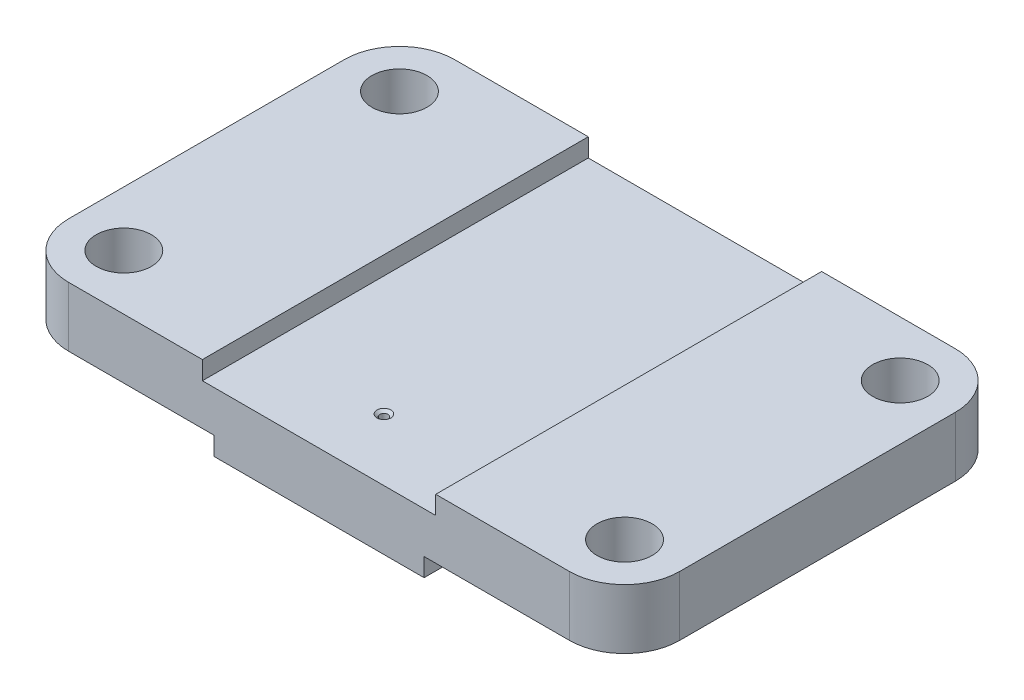
ISO-10303-21;
HEADER;
FILE_DESCRIPTION(('STEP AP214'),'2;1');
FILE_NAME('part.step','',(''),(''),'','','');
FILE_SCHEMA(('AUTOMOTIVE_DESIGN { 1 0 10303 214 1 1 1 1 }'));
ENDSEC;
DATA;
#1=APPLICATION_CONTEXT('core data for automotive mechanical design processes');
#2=APPLICATION_PROTOCOL_DEFINITION('international standard','automotive_design',2000,#1);
#3=PRODUCT_CONTEXT('',#1,'mechanical');
#4=PRODUCT('Part','Part','',(#3));
#5=PRODUCT_RELATED_PRODUCT_CATEGORY('part','',(#4));
#6=PRODUCT_DEFINITION_FORMATION('','',#4);
#7=PRODUCT_DEFINITION_CONTEXT('part definition',#1,'design');
#8=PRODUCT_DEFINITION('design','',#6,#7);
#9=PRODUCT_DEFINITION_SHAPE('','',#8);
#10=(LENGTH_UNIT() NAMED_UNIT(*) SI_UNIT(.MILLI.,.METRE.));
#11=(NAMED_UNIT(*) PLANE_ANGLE_UNIT() SI_UNIT($,.RADIAN.));
#12=(NAMED_UNIT(*) SI_UNIT($,.STERADIAN.) SOLID_ANGLE_UNIT());
#13=UNCERTAINTY_MEASURE_WITH_UNIT(LENGTH_MEASURE(1.E-05),#10,'distance_accuracy_value','');
#14=(GEOMETRIC_REPRESENTATION_CONTEXT(3) GLOBAL_UNCERTAINTY_ASSIGNED_CONTEXT((#13)) GLOBAL_UNIT_ASSIGNED_CONTEXT((#10,
#11,#12)) REPRESENTATION_CONTEXT('',''));
#15=CARTESIAN_POINT('',(0.,0.,0.));
#16=DIRECTION('',(0.,0.,1.));
#17=DIRECTION('',(1.,0.,0.));
#18=AXIS2_PLACEMENT_3D('',#15,#16,#17);
#19=CARTESIAN_POINT('',(66.5,-13.,42.));
#20=DIRECTION('',(0.,1.,0.));
#21=DIRECTION('',(0.,0.,1.));
#22=AXIS2_PLACEMENT_3D('',#19,#20,#21);
#23=PLANE('',#22);
#24=CARTESIAN_POINT('',(54.5,-13.,30.0000000000012));
#25=DIRECTION('',(0.,1.,0.));
#26=DIRECTION('',(0.,0.,1.));
#27=AXIS2_PLACEMENT_3D('',#24,#25,#26);
#28=CIRCLE('',#27,5.99999999999999);
#29=CARTESIAN_POINT('',(54.5,-13.,36.0000000000012));
#30=VERTEX_POINT('',#29);
#31=EDGE_CURVE('E349',#30,#30,#28,.T.);
#32=ORIENTED_EDGE('',*,*,#31,.T.);
#33=EDGE_LOOP('',(#32));
#34=FACE_BOUND('',#33,.T.);
#35=CARTESIAN_POINT('',(54.5,-13.,-29.9999999999988));
#36=DIRECTION('',(0.,1.,0.));
#37=DIRECTION('',(0.,0.,1.));
#38=AXIS2_PLACEMENT_3D('',#35,#36,#37);
#39=CIRCLE('',#38,5.99999999999999);
#40=CARTESIAN_POINT('',(54.5,-13.,-23.9999999999988));
#41=VERTEX_POINT('',#40);
#42=EDGE_CURVE('E342',#41,#41,#39,.T.);
#43=ORIENTED_EDGE('',*,*,#42,.T.);
#44=EDGE_LOOP('',(#43));
#45=FACE_BOUND('',#44,.T.);
#46=DIRECTION('',(0.,0.,1.));
#47=VECTOR('',#46,1.);
#48=CARTESIAN_POINT('',(66.5,-13.,-42.));
#49=LINE('',#48,#47);
#50=CARTESIAN_POINT('',(66.5,-13.,-30.));
#51=VERTEX_POINT('',#50);
#52=CARTESIAN_POINT('',(66.5,-13.,30.));
#53=VERTEX_POINT('',#52);
#54=EDGE_CURVE('E220',#51,#53,#49,.T.);
#55=ORIENTED_EDGE('',*,*,#54,.T.);
#56=CARTESIAN_POINT('',(54.5,-13.,30.));
#57=DIRECTION('',(0.,1.,0.));
#58=DIRECTION('',(0.,0.,1.));
#59=AXIS2_PLACEMENT_3D('',#56,#57,#58);
#60=CIRCLE('',#59,12.);
#61=CARTESIAN_POINT('',(54.5,-13.,42.));
#62=VERTEX_POINT('',#61);
#63=EDGE_CURVE('E303',#53,#62,#60,.F.);
#64=ORIENTED_EDGE('',*,*,#63,.T.);
#65=DIRECTION('',(1.,0.,0.));
#66=VECTOR('',#65,1.);
#67=CARTESIAN_POINT('',(-66.5,-13.,42.));
#68=LINE('',#67,#66);
#69=CARTESIAN_POINT('',(22.86,-13.,42.));
#70=VERTEX_POINT('',#69);
#71=EDGE_CURVE('E182',#70,#62,#68,.T.);
#72=ORIENTED_EDGE('',*,*,#71,.F.);
#73=DIRECTION('',(0.,0.,1.));
#74=VECTOR('',#73,1.);
#75=CARTESIAN_POINT('',(22.86,-13.,-42.));
#76=LINE('',#75,#74);
#77=CARTESIAN_POINT('',(22.86,-13.,-42.));
#78=VERTEX_POINT('',#77);
#79=EDGE_CURVE('E173',#78,#70,#76,.T.);
#80=ORIENTED_EDGE('',*,*,#79,.F.);
#81=DIRECTION('',(-1.,0.,0.));
#82=VECTOR('',#81,1.);
#83=CARTESIAN_POINT('',(66.5,-13.,-42.));
#84=LINE('',#83,#82);
#85=CARTESIAN_POINT('',(54.5,-13.,-42.));
#86=VERTEX_POINT('',#85);
#87=EDGE_CURVE('E154',#86,#78,#84,.T.);
#88=ORIENTED_EDGE('',*,*,#87,.F.);
#89=CARTESIAN_POINT('',(54.5,-13.,-30.));
#90=DIRECTION('',(0.,1.,0.));
#91=DIRECTION('',(0.,0.,1.));
#92=AXIS2_PLACEMENT_3D('',#89,#90,#91);
#93=CIRCLE('',#92,12.);
#94=EDGE_CURVE('E250',#86,#51,#93,.F.);
#95=ORIENTED_EDGE('',*,*,#94,.T.);
#96=EDGE_LOOP('',(#55,#64,#72,#80,#88,#95));
#97=FACE_BOUND('',#96,.T.);
#98=ADVANCED_FACE('F41',(#34,#45,#97),#23,.F.);
#99=CARTESIAN_POINT('',(66.5,0.,42.));
#100=DIRECTION('',(0.,1.,0.));
#101=DIRECTION('',(0.,0.,1.));
#102=AXIS2_PLACEMENT_3D('',#99,#100,#101);
#103=PLANE('',#102);
#104=CARTESIAN_POINT('',(-54.5,0.,-29.9999999999988));
#105=DIRECTION('',(0.,1.,0.));
#106=DIRECTION('',(0.,0.,1.));
#107=AXIS2_PLACEMENT_3D('',#104,#105,#106);
#108=CIRCLE('',#107,5.99999999999999);
#109=CARTESIAN_POINT('',(-54.5,0.,-23.9999999999988));
#110=VERTEX_POINT('',#109);
#111=EDGE_CURVE('E401',#110,#110,#108,.T.);
#112=ORIENTED_EDGE('',*,*,#111,.F.);
#113=EDGE_LOOP('',(#112));
#114=FACE_BOUND('',#113,.T.);
#115=CARTESIAN_POINT('',(-54.5,0.,30.0000000000012));
#116=DIRECTION('',(0.,1.,0.));
#117=DIRECTION('',(0.,0.,1.));
#118=AXIS2_PLACEMENT_3D('',#115,#116,#117);
#119=CIRCLE('',#118,6.);
#120=CARTESIAN_POINT('',(-54.5,0.,36.0000000000012));
#121=VERTEX_POINT('',#120);
#122=EDGE_CURVE('E393',#121,#121,#119,.T.);
#123=ORIENTED_EDGE('',*,*,#122,.F.);
#124=EDGE_LOOP('',(#123));
#125=FACE_BOUND('',#124,.T.);
#126=DIRECTION('',(-1.,0.,0.));
#127=VECTOR('',#126,1.);
#128=CARTESIAN_POINT('',(66.5,0.,-42.));
#129=LINE('',#128,#127);
#130=CARTESIAN_POINT('',(-25.4,0.,-42.));
#131=VERTEX_POINT('',#130);
#132=CARTESIAN_POINT('',(-54.5,0.,-42.));
#133=VERTEX_POINT('',#132);
#134=EDGE_CURVE('E318',#131,#133,#129,.T.);
#135=ORIENTED_EDGE('',*,*,#134,.T.);
#136=CARTESIAN_POINT('',(-54.5,0.,-30.));
#137=DIRECTION('',(0.,1.,0.));
#138=DIRECTION('',(0.,0.,1.));
#139=AXIS2_PLACEMENT_3D('',#136,#137,#138);
#140=CIRCLE('',#139,12.);
#141=CARTESIAN_POINT('',(-66.5,0.,-30.));
#142=VERTEX_POINT('',#141);
#143=EDGE_CURVE('E296',#133,#142,#140,.T.);
#144=ORIENTED_EDGE('',*,*,#143,.T.);
#145=DIRECTION('',(0.,0.,-1.));
#146=VECTOR('',#145,1.);
#147=CARTESIAN_POINT('',(-66.5,0.,42.));
#148=LINE('',#147,#146);
#149=CARTESIAN_POINT('',(-66.5,0.,30.));
#150=VERTEX_POINT('',#149);
#151=EDGE_CURVE('E321',#150,#142,#148,.T.);
#152=ORIENTED_EDGE('',*,*,#151,.F.);
#153=CARTESIAN_POINT('',(-54.5,0.,30.));
#154=DIRECTION('',(0.,1.,0.));
#155=DIRECTION('',(0.,0.,1.));
#156=AXIS2_PLACEMENT_3D('',#153,#154,#155);
#157=CIRCLE('',#156,12.);
#158=CARTESIAN_POINT('',(-54.5,0.,42.));
#159=VERTEX_POINT('',#158);
#160=EDGE_CURVE('E298',#150,#159,#157,.T.);
#161=ORIENTED_EDGE('',*,*,#160,.T.);
#162=DIRECTION('',(1.,0.,0.));
#163=VECTOR('',#162,1.);
#164=CARTESIAN_POINT('',(-66.5,0.,42.));
#165=LINE('',#164,#163);
#166=CARTESIAN_POINT('',(-25.4,0.,42.));
#167=VERTEX_POINT('',#166);
#168=EDGE_CURVE('E333',#159,#167,#165,.T.);
#169=ORIENTED_EDGE('',*,*,#168,.T.);
#170=DIRECTION('',(0.,0.,-1.));
#171=VECTOR('',#170,1.);
#172=CARTESIAN_POINT('',(-25.4,0.,42.));
#173=LINE('',#172,#171);
#174=EDGE_CURVE('E206',#167,#131,#173,.T.);
#175=ORIENTED_EDGE('',*,*,#174,.T.);
#176=EDGE_LOOP('',(#135,#144,#152,#161,#169,#175));
#177=FACE_BOUND('',#176,.T.);
#178=ADVANCED_FACE('F358',(#114,#125,#177),#103,.T.);
#179=CARTESIAN_POINT('',(66.5,-13.,-42.));
#180=DIRECTION('',(-1.,0.,0.));
#181=DIRECTION('',(0.,0.,1.));
#182=AXIS2_PLACEMENT_3D('',#179,#180,#181);
#183=PLANE('',#182);
#184=DIRECTION('',(0.,0.,1.));
#185=VECTOR('',#184,1.);
#186=CARTESIAN_POINT('',(66.5,0.,-42.));
#187=LINE('',#186,#185);
#188=CARTESIAN_POINT('',(66.5,0.,-30.));
#189=VERTEX_POINT('',#188);
#190=CARTESIAN_POINT('',(66.5,0.,30.));
#191=VERTEX_POINT('',#190);
#192=EDGE_CURVE('E219',#189,#191,#187,.T.);
#193=ORIENTED_EDGE('',*,*,#192,.T.);
#194=DIRECTION('',(0.,1.,0.));
#195=VECTOR('',#194,1.);
#196=CARTESIAN_POINT('',(66.5,-13.,30.));
#197=LINE('',#196,#195);
#198=EDGE_CURVE('E249',#191,#53,#197,.F.);
#199=ORIENTED_EDGE('',*,*,#198,.T.);
#200=ORIENTED_EDGE('',*,*,#54,.F.);
#201=DIRECTION('',(0.,1.,0.));
#202=VECTOR('',#201,1.);
#203=CARTESIAN_POINT('',(66.5,0.,-30.));
#204=LINE('',#203,#202);
#205=EDGE_CURVE('E246',#51,#189,#204,.T.);
#206=ORIENTED_EDGE('',*,*,#205,.T.);
#207=EDGE_LOOP('',(#193,#199,#200,#206));
#208=FACE_BOUND('',#207,.T.);
#209=ADVANCED_FACE('F310',(#208),#183,.F.);
#210=CARTESIAN_POINT('',(-66.5,-13.,42.));
#211=DIRECTION('',(0.,0.,1.));
#212=DIRECTION('',(1.,0.,0.));
#213=AXIS2_PLACEMENT_3D('',#210,#211,#212);
#214=PLANE('',#213);
#215=ORIENTED_EDGE('',*,*,#71,.T.);
#216=DIRECTION('',(0.,1.,0.));
#217=VECTOR('',#216,1.);
#218=CARTESIAN_POINT('',(54.5,0.,42.));
#219=LINE('',#218,#217);
#220=CARTESIAN_POINT('',(54.5,0.,42.));
#221=VERTEX_POINT('',#220);
#222=EDGE_CURVE('E239',#62,#221,#219,.T.);
#223=ORIENTED_EDGE('',*,*,#222,.T.);
#224=CARTESIAN_POINT('',(25.4,0.,42.));
#225=VERTEX_POINT('',#224);
#226=EDGE_CURVE('E336',#225,#221,#165,.T.);
#227=ORIENTED_EDGE('',*,*,#226,.F.);
#228=DIRECTION('',(0.,-1.,0.));
#229=VECTOR('',#228,1.);
#230=CARTESIAN_POINT('',(25.4,0.,42.));
#231=LINE('',#230,#229);
#232=CARTESIAN_POINT('',(25.4,-4.00000000000001,42.));
#233=VERTEX_POINT('',#232);
#234=EDGE_CURVE('E186',#225,#233,#231,.T.);
#235=ORIENTED_EDGE('',*,*,#234,.T.);
#236=DIRECTION('',(-1.,0.,0.));
#237=VECTOR('',#236,1.);
#238=CARTESIAN_POINT('',(-25.4,-4.,42.));
#239=LINE('',#238,#237);
#240=CARTESIAN_POINT('',(-25.4,-4.,42.));
#241=VERTEX_POINT('',#240);
#242=EDGE_CURVE('E201',#233,#241,#239,.T.);
#243=ORIENTED_EDGE('',*,*,#242,.T.);
#244=DIRECTION('',(0.,1.,0.));
#245=VECTOR('',#244,1.);
#246=CARTESIAN_POINT('',(-25.4,0.,42.));
#247=LINE('',#246,#245);
#248=EDGE_CURVE('E204',#241,#167,#247,.T.);
#249=ORIENTED_EDGE('',*,*,#248,.T.);
#250=ORIENTED_EDGE('',*,*,#168,.F.);
#251=DIRECTION('',(0.,1.,0.));
#252=VECTOR('',#251,1.);
#253=CARTESIAN_POINT('',(-54.5,-13.,42.));
#254=LINE('',#253,#252);
#255=CARTESIAN_POINT('',(-54.5,-13.,42.));
#256=VERTEX_POINT('',#255);
#257=EDGE_CURVE('E237',#159,#256,#254,.F.);
#258=ORIENTED_EDGE('',*,*,#257,.T.);
#259=CARTESIAN_POINT('',(-22.86,-13.,42.));
#260=VERTEX_POINT('',#259);
#261=EDGE_CURVE('E232',#256,#260,#68,.T.);
#262=ORIENTED_EDGE('',*,*,#261,.T.);
#263=DIRECTION('',(0.,-1.,0.));
#264=VECTOR('',#263,1.);
#265=CARTESIAN_POINT('',(-22.86,-13.,42.));
#266=LINE('',#265,#264);
#267=CARTESIAN_POINT('',(-22.86,-17.,42.));
#268=VERTEX_POINT('',#267);
#269=EDGE_CURVE('E178',#260,#268,#266,.T.);
#270=ORIENTED_EDGE('',*,*,#269,.T.);
#271=DIRECTION('',(1.,0.,0.));
#272=VECTOR('',#271,1.);
#273=CARTESIAN_POINT('',(-22.86,-17.,42.));
#274=LINE('',#273,#272);
#275=CARTESIAN_POINT('',(22.86,-17.,42.));
#276=VERTEX_POINT('',#275);
#277=EDGE_CURVE('E261',#268,#276,#274,.T.);
#278=ORIENTED_EDGE('',*,*,#277,.T.);
#279=DIRECTION('',(0.,-1.,0.));
#280=VECTOR('',#279,1.);
#281=CARTESIAN_POINT('',(22.86,-13.,42.));
#282=LINE('',#281,#280);
#283=EDGE_CURVE('E194',#70,#276,#282,.T.);
#284=ORIENTED_EDGE('',*,*,#283,.F.);
#285=EDGE_LOOP('',(#215,#223,#227,#235,#243,#249,#250,#258,#262,#270,#278,#284));
#286=FACE_BOUND('',#285,.T.);
#287=ADVANCED_FACE('F283',(#286),#214,.T.);
#288=CARTESIAN_POINT('',(-66.5,-13.,42.));
#289=DIRECTION('',(1.,0.,0.));
#290=DIRECTION('',(0.,0.,-1.));
#291=AXIS2_PLACEMENT_3D('',#288,#289,#290);
#292=PLANE('',#291);
#293=ORIENTED_EDGE('',*,*,#151,.T.);
#294=DIRECTION('',(0.,1.,0.));
#295=VECTOR('',#294,1.);
#296=CARTESIAN_POINT('',(-66.5,-13.,-30.));
#297=LINE('',#296,#295);
#298=CARTESIAN_POINT('',(-66.5,-13.,-30.));
#299=VERTEX_POINT('',#298);
#300=EDGE_CURVE('E57',#142,#299,#297,.F.);
#301=ORIENTED_EDGE('',*,*,#300,.T.);
#302=DIRECTION('',(0.,0.,-1.));
#303=VECTOR('',#302,1.);
#304=CARTESIAN_POINT('',(-66.5,-13.,42.));
#305=LINE('',#304,#303);
#306=CARTESIAN_POINT('',(-66.5,-13.,30.));
#307=VERTEX_POINT('',#306);
#308=EDGE_CURVE('E225',#307,#299,#305,.T.);
#309=ORIENTED_EDGE('',*,*,#308,.F.);
#310=DIRECTION('',(0.,1.,0.));
#311=VECTOR('',#310,1.);
#312=CARTESIAN_POINT('',(-66.5,0.,30.));
#313=LINE('',#312,#311);
#314=EDGE_CURVE('E291',#307,#150,#313,.T.);
#315=ORIENTED_EDGE('',*,*,#314,.T.);
#316=EDGE_LOOP('',(#293,#301,#309,#315));
#317=FACE_BOUND('',#316,.T.);
#318=ADVANCED_FACE('F360',(#317),#292,.F.);
#319=CARTESIAN_POINT('',(66.5,-13.,-42.));
#320=DIRECTION('',(0.,0.,-1.));
#321=DIRECTION('',(-1.,0.,0.));
#322=AXIS2_PLACEMENT_3D('',#319,#320,#321);
#323=PLANE('',#322);
#324=CARTESIAN_POINT('',(54.5,0.,-42.));
#325=VERTEX_POINT('',#324);
#326=CARTESIAN_POINT('',(25.4,0.,-42.));
#327=VERTEX_POINT('',#326);
#328=EDGE_CURVE('E222',#325,#327,#129,.T.);
#329=ORIENTED_EDGE('',*,*,#328,.F.);
#330=DIRECTION('',(0.,1.,0.));
#331=VECTOR('',#330,1.);
#332=CARTESIAN_POINT('',(54.5,-13.,-42.));
#333=LINE('',#332,#331);
#334=EDGE_CURVE('E162',#325,#86,#333,.F.);
#335=ORIENTED_EDGE('',*,*,#334,.T.);
#336=ORIENTED_EDGE('',*,*,#87,.T.);
#337=DIRECTION('',(0.,-1.,0.));
#338=VECTOR('',#337,1.);
#339=CARTESIAN_POINT('',(22.86,-13.,-42.));
#340=LINE('',#339,#338);
#341=CARTESIAN_POINT('',(22.86,-17.,-42.));
#342=VERTEX_POINT('',#341);
#343=EDGE_CURVE('E159',#78,#342,#340,.T.);
#344=ORIENTED_EDGE('',*,*,#343,.T.);
#345=DIRECTION('',(1.,0.,0.));
#346=VECTOR('',#345,1.);
#347=CARTESIAN_POINT('',(-22.86,-17.,-42.));
#348=LINE('',#347,#346);
#349=CARTESIAN_POINT('',(-22.86,-17.,-42.));
#350=VERTEX_POINT('',#349);
#351=EDGE_CURVE('E177',#350,#342,#348,.T.);
#352=ORIENTED_EDGE('',*,*,#351,.F.);
#353=DIRECTION('',(0.,-1.,0.));
#354=VECTOR('',#353,1.);
#355=CARTESIAN_POINT('',(-22.86,-13.,-42.));
#356=LINE('',#355,#354);
#357=CARTESIAN_POINT('',(-22.86,-13.,-42.));
#358=VERTEX_POINT('',#357);
#359=EDGE_CURVE('E268',#358,#350,#356,.T.);
#360=ORIENTED_EDGE('',*,*,#359,.F.);
#361=CARTESIAN_POINT('',(-54.5,-13.,-42.));
#362=VERTEX_POINT('',#361);
#363=EDGE_CURVE('E167',#358,#362,#84,.T.);
#364=ORIENTED_EDGE('',*,*,#363,.T.);
#365=DIRECTION('',(0.,1.,0.));
#366=VECTOR('',#365,1.);
#367=CARTESIAN_POINT('',(-54.5,0.,-42.));
#368=LINE('',#367,#366);
#369=EDGE_CURVE('E301',#362,#133,#368,.T.);
#370=ORIENTED_EDGE('',*,*,#369,.T.);
#371=ORIENTED_EDGE('',*,*,#134,.F.);
#372=DIRECTION('',(0.,1.,0.));
#373=VECTOR('',#372,1.);
#374=CARTESIAN_POINT('',(-25.4,-13.0000000000001,-42.));
#375=LINE('',#374,#373);
#376=CARTESIAN_POINT('',(-25.4,-4.,-42.));
#377=VERTEX_POINT('',#376);
#378=EDGE_CURVE('E216',#377,#131,#375,.T.);
#379=ORIENTED_EDGE('',*,*,#378,.F.);
#380=DIRECTION('',(-1.,0.,0.));
#381=VECTOR('',#380,1.);
#382=CARTESIAN_POINT('',(66.5,-4.00000000000001,-42.));
#383=LINE('',#382,#381);
#384=CARTESIAN_POINT('',(25.4,-4.00000000000001,-42.));
#385=VERTEX_POINT('',#384);
#386=EDGE_CURVE('E166',#385,#377,#383,.T.);
#387=ORIENTED_EDGE('',*,*,#386,.F.);
#388=DIRECTION('',(0.,-1.,0.));
#389=VECTOR('',#388,1.);
#390=CARTESIAN_POINT('',(25.4,-13.,-42.));
#391=LINE('',#390,#389);
#392=EDGE_CURVE('E213',#327,#385,#391,.T.);
#393=ORIENTED_EDGE('',*,*,#392,.F.);
#394=EDGE_LOOP('',(#329,#335,#336,#344,#352,#360,#364,#370,#371,#379,#387,#393));
#395=FACE_BOUND('',#394,.T.);
#396=ADVANCED_FACE('F157',(#395),#323,.T.);
#397=CARTESIAN_POINT('',(-54.5,-13.,-29.9999999999988));
#398=DIRECTION('',(0.,1.,0.));
#399=DIRECTION('',(0.,0.,1.));
#400=AXIS2_PLACEMENT_3D('',#397,#398,#399);
#401=CIRCLE('',#400,5.99999999999999);
#402=CARTESIAN_POINT('',(-54.5,-13.,-23.9999999999988));
#403=VERTEX_POINT('',#402);
#404=EDGE_CURVE('E235',#403,#403,#401,.T.);
#405=ORIENTED_EDGE('',*,*,#404,.T.);
#406=EDGE_LOOP('',(#405));
#407=FACE_BOUND('',#406,.T.);
#408=CARTESIAN_POINT('',(-54.5,-13.,30.0000000000012));
#409=DIRECTION('',(0.,1.,0.));
#410=DIRECTION('',(0.,0.,1.));
#411=AXIS2_PLACEMENT_3D('',#408,#409,#410);
#412=CIRCLE('',#411,6.);
#413=CARTESIAN_POINT('',(-54.5,-13.,36.0000000000012));
#414=VERTEX_POINT('',#413);
#415=EDGE_CURVE('E390',#414,#414,#412,.T.);
#416=ORIENTED_EDGE('',*,*,#415,.T.);
#417=EDGE_LOOP('',(#416));
#418=FACE_BOUND('',#417,.T.);
#419=ORIENTED_EDGE('',*,*,#308,.T.);
#420=CARTESIAN_POINT('',(-54.5,-13.,-30.));
#421=DIRECTION('',(0.,1.,0.));
#422=DIRECTION('',(0.,0.,1.));
#423=AXIS2_PLACEMENT_3D('',#420,#421,#422);
#424=CIRCLE('',#423,12.);
#425=EDGE_CURVE('E11',#299,#362,#424,.F.);
#426=ORIENTED_EDGE('',*,*,#425,.T.);
#427=ORIENTED_EDGE('',*,*,#363,.F.);
#428=DIRECTION('',(0.,0.,1.));
#429=VECTOR('',#428,1.);
#430=CARTESIAN_POINT('',(-22.86,-13.,-42.));
#431=LINE('',#430,#429);
#432=EDGE_CURVE('E264',#358,#260,#431,.T.);
#433=ORIENTED_EDGE('',*,*,#432,.T.);
#434=ORIENTED_EDGE('',*,*,#261,.F.);
#435=CARTESIAN_POINT('',(-54.5,-13.,30.));
#436=DIRECTION('',(0.,1.,0.));
#437=DIRECTION('',(0.,0.,1.));
#438=AXIS2_PLACEMENT_3D('',#435,#436,#437);
#439=CIRCLE('',#438,12.);
#440=EDGE_CURVE('E50',#256,#307,#439,.F.);
#441=ORIENTED_EDGE('',*,*,#440,.T.);
#442=EDGE_LOOP('',(#419,#426,#427,#433,#434,#441));
#443=FACE_BOUND('',#442,.T.);
#444=ADVANCED_FACE('F286',(#407,#418,#443),#23,.F.);
#445=CARTESIAN_POINT('',(54.5,0.,30.0000000000012));
#446=DIRECTION('',(0.,1.,0.));
#447=DIRECTION('',(0.,0.,1.));
#448=AXIS2_PLACEMENT_3D('',#445,#446,#447);
#449=CIRCLE('',#448,5.99999999999999);
#450=CARTESIAN_POINT('',(54.5,0.,36.0000000000012));
#451=VERTEX_POINT('',#450);
#452=EDGE_CURVE('E392',#451,#451,#449,.T.);
#453=ORIENTED_EDGE('',*,*,#452,.F.);
#454=EDGE_LOOP('',(#453));
#455=FACE_BOUND('',#454,.T.);
#456=CARTESIAN_POINT('',(54.5,0.,-29.9999999999988));
#457=DIRECTION('',(0.,1.,0.));
#458=DIRECTION('',(0.,0.,1.));
#459=AXIS2_PLACEMENT_3D('',#456,#457,#458);
#460=CIRCLE('',#459,5.99999999999999);
#461=CARTESIAN_POINT('',(54.5,0.,-23.9999999999988));
#462=VERTEX_POINT('',#461);
#463=EDGE_CURVE('E344',#462,#462,#460,.T.);
#464=ORIENTED_EDGE('',*,*,#463,.F.);
#465=EDGE_LOOP('',(#464));
#466=FACE_BOUND('',#465,.T.);
#467=ORIENTED_EDGE('',*,*,#226,.T.);
#468=CARTESIAN_POINT('',(54.5,0.,30.));
#469=DIRECTION('',(0.,1.,0.));
#470=DIRECTION('',(0.,0.,1.));
#471=AXIS2_PLACEMENT_3D('',#468,#469,#470);
#472=CIRCLE('',#471,12.);
#473=EDGE_CURVE('E244',#221,#191,#472,.T.);
#474=ORIENTED_EDGE('',*,*,#473,.T.);
#475=ORIENTED_EDGE('',*,*,#192,.F.);
#476=CARTESIAN_POINT('',(54.5,0.,-30.));
#477=DIRECTION('',(0.,1.,0.));
#478=DIRECTION('',(0.,0.,1.));
#479=AXIS2_PLACEMENT_3D('',#476,#477,#478);
#480=CIRCLE('',#479,12.);
#481=EDGE_CURVE('E242',#189,#325,#480,.T.);
#482=ORIENTED_EDGE('',*,*,#481,.T.);
#483=ORIENTED_EDGE('',*,*,#328,.T.);
#484=DIRECTION('',(0.,0.,-1.));
#485=VECTOR('',#484,1.);
#486=CARTESIAN_POINT('',(25.4,0.,42.));
#487=LINE('',#486,#485);
#488=EDGE_CURVE('E183',#225,#327,#487,.T.);
#489=ORIENTED_EDGE('',*,*,#488,.F.);
#490=EDGE_LOOP('',(#467,#474,#475,#482,#483,#489));
#491=FACE_BOUND('',#490,.T.);
#492=ADVANCED_FACE('F316',(#455,#466,#491),#103,.T.);
#493=CARTESIAN_POINT('',(-25.4,0.,42.));
#494=DIRECTION('',(-1.,0.,0.));
#495=DIRECTION('',(0.,-1.,0.));
#496=AXIS2_PLACEMENT_3D('',#493,#494,#495);
#497=PLANE('',#496);
#498=DIRECTION('',(0.,0.,-1.));
#499=VECTOR('',#498,1.);
#500=CARTESIAN_POINT('',(-25.4,-4.,42.));
#501=LINE('',#500,#499);
#502=EDGE_CURVE('E203',#241,#377,#501,.T.);
#503=ORIENTED_EDGE('',*,*,#502,.T.);
#504=ORIENTED_EDGE('',*,*,#378,.T.);
#505=ORIENTED_EDGE('',*,*,#174,.F.);
#506=ORIENTED_EDGE('',*,*,#248,.F.);
#507=EDGE_LOOP('',(#503,#504,#505,#506));
#508=FACE_BOUND('',#507,.T.);
#509=ADVANCED_FACE('F331',(#508),#497,.F.);
#510=CARTESIAN_POINT('',(-25.4,-4.,42.));
#511=DIRECTION('',(0.,-1.,0.));
#512=DIRECTION('',(1.,0.,0.));
#513=AXIS2_PLACEMENT_3D('',#510,#511,#512);
#514=PLANE('',#513);
#515=CARTESIAN_POINT('',(0.622969363223918,-4.,28.5000321046915));
#516=DIRECTION('',(0.,1.,0.));
#517=DIRECTION('',(0.,0.,1.));
#518=AXIS2_PLACEMENT_3D('',#515,#516,#517);
#519=CIRCLE('',#518,1.5113);
#520=CARTESIAN_POINT('',(0.622969363223918,-4.,30.0113321046915));
#521=VERTEX_POINT('',#520);
#522=EDGE_CURVE('E588',#521,#521,#519,.T.);
#523=ORIENTED_EDGE('',*,*,#522,.F.);
#524=EDGE_LOOP('',(#523));
#525=FACE_BOUND('',#524,.T.);
#526=DIRECTION('',(0.,0.,-1.));
#527=VECTOR('',#526,1.);
#528=CARTESIAN_POINT('',(25.4,-4.00000000000001,42.));
#529=LINE('',#528,#527);
#530=EDGE_CURVE('E200',#233,#385,#529,.T.);
#531=ORIENTED_EDGE('',*,*,#530,.T.);
#532=ORIENTED_EDGE('',*,*,#386,.T.);
#533=ORIENTED_EDGE('',*,*,#502,.F.);
#534=ORIENTED_EDGE('',*,*,#242,.F.);
#535=EDGE_LOOP('',(#531,#532,#533,#534));
#536=FACE_BOUND('',#535,.T.);
#537=ADVANCED_FACE('F326',(#525,#536),#514,.F.);
#538=CARTESIAN_POINT('',(25.4,0.,42.));
#539=DIRECTION('',(1.,0.,0.));
#540=DIRECTION('',(0.,1.,0.));
#541=AXIS2_PLACEMENT_3D('',#538,#539,#540);
#542=PLANE('',#541);
#543=ORIENTED_EDGE('',*,*,#488,.T.);
#544=ORIENTED_EDGE('',*,*,#392,.T.);
#545=ORIENTED_EDGE('',*,*,#530,.F.);
#546=ORIENTED_EDGE('',*,*,#234,.F.);
#547=EDGE_LOOP('',(#543,#544,#545,#546));
#548=FACE_BOUND('',#547,.T.);
#549=ADVANCED_FACE('F338',(#548),#542,.F.);
#550=CARTESIAN_POINT('',(22.86,-13.,-42.));
#551=DIRECTION('',(-1.,0.,0.));
#552=DIRECTION('',(0.,0.,1.));
#553=AXIS2_PLACEMENT_3D('',#550,#551,#552);
#554=PLANE('',#553);
#555=ORIENTED_EDGE('',*,*,#283,.T.);
#556=DIRECTION('',(0.,0.,1.));
#557=VECTOR('',#556,1.);
#558=CARTESIAN_POINT('',(22.86,-17.,-42.));
#559=LINE('',#558,#557);
#560=EDGE_CURVE('E175',#342,#276,#559,.T.);
#561=ORIENTED_EDGE('',*,*,#560,.F.);
#562=ORIENTED_EDGE('',*,*,#343,.F.);
#563=ORIENTED_EDGE('',*,*,#79,.T.);
#564=EDGE_LOOP('',(#555,#561,#562,#563));
#565=FACE_BOUND('',#564,.T.);
#566=ADVANCED_FACE('F172',(#565),#554,.F.);
#567=CARTESIAN_POINT('',(-22.86,-17.,-42.));
#568=DIRECTION('',(0.,-1.,0.));
#569=DIRECTION('',(1.,0.,0.));
#570=AXIS2_PLACEMENT_3D('',#567,#568,#569);
#571=PLANE('',#570);
#572=CARTESIAN_POINT('',(0.622969363223918,-17.,28.5000321046915));
#573=DIRECTION('',(0.,-1.,0.));
#574=DIRECTION('',(1.,0.,0.));
#575=AXIS2_PLACEMENT_3D('',#572,#573,#574);
#576=CIRCLE('',#575,0.888999999999987);
#577=CARTESIAN_POINT('',(1.5119693632239,-17.,28.5000321046915));
#578=VERTEX_POINT('',#577);
#579=EDGE_CURVE('E45',#578,#578,#576,.T.);
#580=ORIENTED_EDGE('',*,*,#579,.F.);
#581=EDGE_LOOP('',(#580));
#582=FACE_BOUND('',#581,.T.);
#583=ORIENTED_EDGE('',*,*,#277,.F.);
#584=DIRECTION('',(0.,0.,1.));
#585=VECTOR('',#584,1.);
#586=CARTESIAN_POINT('',(-22.86,-17.,-42.));
#587=LINE('',#586,#585);
#588=EDGE_CURVE('E188',#350,#268,#587,.T.);
#589=ORIENTED_EDGE('',*,*,#588,.F.);
#590=ORIENTED_EDGE('',*,*,#351,.T.);
#591=ORIENTED_EDGE('',*,*,#560,.T.);
#592=EDGE_LOOP('',(#583,#589,#590,#591));
#593=FACE_BOUND('',#592,.T.);
#594=ADVANCED_FACE('F281',(#582,#593),#571,.T.);
#595=CARTESIAN_POINT('',(-22.86,-13.,-42.));
#596=DIRECTION('',(-1.,0.,0.));
#597=DIRECTION('',(0.,0.,1.));
#598=AXIS2_PLACEMENT_3D('',#595,#596,#597);
#599=PLANE('',#598);
#600=ORIENTED_EDGE('',*,*,#269,.F.);
#601=ORIENTED_EDGE('',*,*,#432,.F.);
#602=ORIENTED_EDGE('',*,*,#359,.T.);
#603=ORIENTED_EDGE('',*,*,#588,.T.);
#604=EDGE_LOOP('',(#600,#601,#602,#603));
#605=FACE_BOUND('',#604,.T.);
#606=ADVANCED_FACE('F277',(#605),#599,.T.);
#607=CARTESIAN_POINT('',(54.5,-17.000025,-29.9999999999988));
#608=DIRECTION('',(0.,1.,0.));
#609=DIRECTION('',(0.,0.,1.));
#610=AXIS2_PLACEMENT_3D('',#607,#608,#609);
#611=CYLINDRICAL_SURFACE('',#610,5.99999999999999);
#612=ORIENTED_EDGE('',*,*,#463,.T.);
#613=EDGE_LOOP('',(#612));
#614=FACE_BOUND('',#613,.T.);
#615=ORIENTED_EDGE('',*,*,#42,.F.);
#616=EDGE_LOOP('',(#615));
#617=FACE_BOUND('',#616,.T.);
#618=ADVANCED_FACE('F409',(#614,#617),#611,.F.);
#619=CARTESIAN_POINT('',(54.5,-17.000025,30.0000000000012));
#620=DIRECTION('',(0.,1.,0.));
#621=DIRECTION('',(0.,0.,1.));
#622=AXIS2_PLACEMENT_3D('',#619,#620,#621);
#623=CYLINDRICAL_SURFACE('',#622,5.99999999999999);
#624=ORIENTED_EDGE('',*,*,#452,.T.);
#625=EDGE_LOOP('',(#624));
#626=FACE_BOUND('',#625,.T.);
#627=ORIENTED_EDGE('',*,*,#31,.F.);
#628=EDGE_LOOP('',(#627));
#629=FACE_BOUND('',#628,.T.);
#630=ADVANCED_FACE('F406',(#626,#629),#623,.F.);
#631=CARTESIAN_POINT('',(-54.5,-17.000025,30.0000000000012));
#632=DIRECTION('',(0.,1.,0.));
#633=DIRECTION('',(0.,0.,1.));
#634=AXIS2_PLACEMENT_3D('',#631,#632,#633);
#635=CYLINDRICAL_SURFACE('',#634,6.);
#636=ORIENTED_EDGE('',*,*,#122,.T.);
#637=EDGE_LOOP('',(#636));
#638=FACE_BOUND('',#637,.T.);
#639=ORIENTED_EDGE('',*,*,#415,.F.);
#640=EDGE_LOOP('',(#639));
#641=FACE_BOUND('',#640,.T.);
#642=ADVANCED_FACE('F408',(#638,#641),#635,.F.);
#643=CARTESIAN_POINT('',(-54.5,-17.000025,-29.9999999999988));
#644=DIRECTION('',(0.,1.,0.));
#645=DIRECTION('',(0.,0.,1.));
#646=AXIS2_PLACEMENT_3D('',#643,#644,#645);
#647=CYLINDRICAL_SURFACE('',#646,5.99999999999999);
#648=ORIENTED_EDGE('',*,*,#111,.T.);
#649=EDGE_LOOP('',(#648));
#650=FACE_BOUND('',#649,.T.);
#651=ORIENTED_EDGE('',*,*,#404,.F.);
#652=EDGE_LOOP('',(#651));
#653=FACE_BOUND('',#652,.T.);
#654=ADVANCED_FACE('F416',(#650,#653),#647,.F.);
#655=CARTESIAN_POINT('',(54.5,-13.,30.));
#656=DIRECTION('',(0.,-1.,0.));
#657=DIRECTION('',(0.,0.,-1.));
#658=AXIS2_PLACEMENT_3D('',#655,#656,#657);
#659=CYLINDRICAL_SURFACE('',#658,12.);
#660=ORIENTED_EDGE('',*,*,#63,.F.);
#661=ORIENTED_EDGE('',*,*,#198,.F.);
#662=ORIENTED_EDGE('',*,*,#473,.F.);
#663=ORIENTED_EDGE('',*,*,#222,.F.);
#664=EDGE_LOOP('',(#660,#661,#662,#663));
#665=FACE_BOUND('',#664,.T.);
#666=ADVANCED_FACE('F340',(#665),#659,.T.);
#667=CARTESIAN_POINT('',(54.5,-13.,-30.));
#668=DIRECTION('',(0.,-1.,0.));
#669=DIRECTION('',(0.,0.,-1.));
#670=AXIS2_PLACEMENT_3D('',#667,#668,#669);
#671=CYLINDRICAL_SURFACE('',#670,12.);
#672=ORIENTED_EDGE('',*,*,#94,.F.);
#673=ORIENTED_EDGE('',*,*,#334,.F.);
#674=ORIENTED_EDGE('',*,*,#481,.F.);
#675=ORIENTED_EDGE('',*,*,#205,.F.);
#676=EDGE_LOOP('',(#672,#673,#674,#675));
#677=FACE_BOUND('',#676,.T.);
#678=ADVANCED_FACE('F313',(#677),#671,.T.);
#679=CARTESIAN_POINT('',(-54.5,-13.,-30.));
#680=DIRECTION('',(0.,-1.,0.));
#681=DIRECTION('',(0.,0.,-1.));
#682=AXIS2_PLACEMENT_3D('',#679,#680,#681);
#683=CYLINDRICAL_SURFACE('',#682,12.);
#684=ORIENTED_EDGE('',*,*,#425,.F.);
#685=ORIENTED_EDGE('',*,*,#300,.F.);
#686=ORIENTED_EDGE('',*,*,#143,.F.);
#687=ORIENTED_EDGE('',*,*,#369,.F.);
#688=EDGE_LOOP('',(#684,#685,#686,#687));
#689=FACE_BOUND('',#688,.T.);
#690=ADVANCED_FACE('F355',(#689),#683,.T.);
#691=CARTESIAN_POINT('',(-54.5,-13.,30.));
#692=DIRECTION('',(0.,-1.,0.));
#693=DIRECTION('',(0.,0.,-1.));
#694=AXIS2_PLACEMENT_3D('',#691,#692,#693);
#695=CYLINDRICAL_SURFACE('',#694,12.);
#696=ORIENTED_EDGE('',*,*,#440,.F.);
#697=ORIENTED_EDGE('',*,*,#257,.F.);
#698=ORIENTED_EDGE('',*,*,#160,.F.);
#699=ORIENTED_EDGE('',*,*,#314,.F.);
#700=EDGE_LOOP('',(#696,#697,#698,#699));
#701=FACE_BOUND('',#700,.T.);
#702=ADVANCED_FACE('F43',(#701),#695,.T.);
#703=CARTESIAN_POINT('',(0.622969363223918,-4.,28.5000321046915));
#704=DIRECTION('',(0.,1.,0.));
#705=DIRECTION('',(0.,0.,1.));
#706=AXIS2_PLACEMENT_3D('',#703,#704,#705);
#707=CYLINDRICAL_SURFACE('',#706,0.888999999999987);
#708=ORIENTED_EDGE('',*,*,#579,.T.);
#709=EDGE_LOOP('',(#708));
#710=FACE_BOUND('',#709,.T.);
#711=CARTESIAN_POINT('',(0.622969363223918,-4.52217170048164,28.5000321046915));
#712=DIRECTION('',(0.,1.,0.));
#713=DIRECTION('',(0.,0.,1.));
#714=AXIS2_PLACEMENT_3D('',#711,#712,#713);
#715=CIRCLE('',#714,0.888999999999987);
#716=CARTESIAN_POINT('',(0.622969363223918,-4.52217170048164,29.3890321046914));
#717=VERTEX_POINT('',#716);
#718=EDGE_CURVE('E585',#717,#717,#715,.T.);
#719=ORIENTED_EDGE('',*,*,#718,.T.);
#720=EDGE_LOOP('',(#719));
#721=FACE_BOUND('',#720,.T.);
#722=ADVANCED_FACE('F556',(#710,#721),#707,.F.);
#723=CARTESIAN_POINT('',(0.622969363223918,-4.,28.5000321046915));
#724=DIRECTION('',(0.,1.,0.));
#725=DIRECTION('',(0.,0.,1.));
#726=AXIS2_PLACEMENT_3D('',#723,#724,#725);
#727=CONICAL_SURFACE('',#726,1.5113,0.872664625997162);
#728=ORIENTED_EDGE('',*,*,#718,.F.);
#729=EDGE_LOOP('',(#728));
#730=FACE_BOUND('',#729,.T.);
#731=ORIENTED_EDGE('',*,*,#522,.T.);
#732=EDGE_LOOP('',(#731));
#733=FACE_BOUND('',#732,.T.);
#734=ADVANCED_FACE('F564',(#730,#733),#727,.F.);
#735=CLOSED_SHELL('',(#98,#178,#209,#287,#318,#396,#444,#492,#509,#537,#549,#566,#594,#606,#618,
#630,#642,#654,#666,#678,#690,#702,#722,#734));
#736=MANIFOLD_SOLID_BREP('B2',#735);
#737=ADVANCED_BREP_SHAPE_REPRESENTATION('',(#18,#736),#14);
#738=SHAPE_DEFINITION_REPRESENTATION(#9,#737);
ENDSEC;
END-ISO-10303-21;
